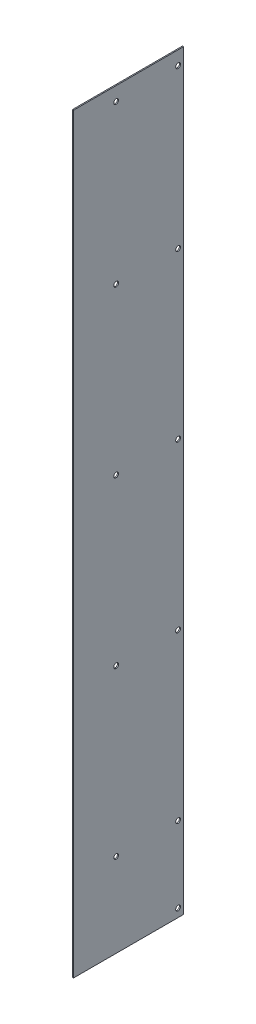
ISO-10303-21;
HEADER;
FILE_DESCRIPTION(('STEP AP214'),'2;1');
FILE_NAME('part.step','',(''),(''),'','','');
FILE_SCHEMA(('AUTOMOTIVE_DESIGN { 1 0 10303 214 1 1 1 1 }'));
ENDSEC;
DATA;
#1=APPLICATION_CONTEXT('core data for automotive mechanical design processes');
#2=APPLICATION_PROTOCOL_DEFINITION('international standard','automotive_design',2000,#1);
#3=PRODUCT_CONTEXT('',#1,'mechanical');
#4=PRODUCT('Part','Part','',(#3));
#5=PRODUCT_RELATED_PRODUCT_CATEGORY('part','',(#4));
#6=PRODUCT_DEFINITION_FORMATION('','',#4);
#7=PRODUCT_DEFINITION_CONTEXT('part definition',#1,'design');
#8=PRODUCT_DEFINITION('design','',#6,#7);
#9=PRODUCT_DEFINITION_SHAPE('','',#8);
#10=(LENGTH_UNIT() NAMED_UNIT(*) SI_UNIT(.MILLI.,.METRE.));
#11=(NAMED_UNIT(*) PLANE_ANGLE_UNIT() SI_UNIT($,.RADIAN.));
#12=(NAMED_UNIT(*) SI_UNIT($,.STERADIAN.) SOLID_ANGLE_UNIT());
#13=UNCERTAINTY_MEASURE_WITH_UNIT(LENGTH_MEASURE(1.E-05),#10,'distance_accuracy_value','');
#14=(GEOMETRIC_REPRESENTATION_CONTEXT(3) GLOBAL_UNCERTAINTY_ASSIGNED_CONTEXT((#13)) GLOBAL_UNIT_ASSIGNED_CONTEXT((#10,
#11,#12)) REPRESENTATION_CONTEXT('',''));
#15=CARTESIAN_POINT('',(0.,0.,0.));
#16=DIRECTION('',(0.,0.,1.));
#17=DIRECTION('',(1.,0.,0.));
#18=AXIS2_PLACEMENT_3D('',#15,#16,#17);
#19=CARTESIAN_POINT('',(1.6,-2.22044604925031E-13,-160.));
#20=DIRECTION('',(0.,1.,0.));
#21=DIRECTION('',(0.,0.,1.));
#22=AXIS2_PLACEMENT_3D('',#19,#20,#21);
#23=PLANE('',#22);
#24=DIRECTION('',(0.,0.,-1.));
#25=VECTOR('',#24,1.);
#26=CARTESIAN_POINT('',(0.,-2.22044604925031E-13,-160.));
#27=LINE('',#26,#25);
#28=CARTESIAN_POINT('',(0.,0.,0.));
#29=VERTEX_POINT('',#28);
#30=CARTESIAN_POINT('',(0.,-2.22044604925031E-13,-160.));
#31=VERTEX_POINT('',#30);
#32=EDGE_CURVE('E103',#29,#31,#27,.T.);
#33=ORIENTED_EDGE('',*,*,#32,.T.);
#34=DIRECTION('',(-1.,0.,0.));
#35=VECTOR('',#34,1.);
#36=CARTESIAN_POINT('',(1.6,-2.22044604925031E-13,-160.));
#37=LINE('',#36,#35);
#38=CARTESIAN_POINT('',(1.6,-2.22044604925031E-13,-160.));
#39=VERTEX_POINT('',#38);
#40=EDGE_CURVE('E94',#39,#31,#37,.T.);
#41=ORIENTED_EDGE('',*,*,#40,.F.);
#42=DIRECTION('',(0.,0.,-1.));
#43=VECTOR('',#42,1.);
#44=CARTESIAN_POINT('',(1.6,-2.22044604925031E-13,-160.));
#45=LINE('',#44,#43);
#46=CARTESIAN_POINT('',(1.6,0.,0.));
#47=VERTEX_POINT('',#46);
#48=EDGE_CURVE('E88',#47,#39,#45,.T.);
#49=ORIENTED_EDGE('',*,*,#48,.F.);
#50=DIRECTION('',(-1.,0.,0.));
#51=VECTOR('',#50,1.);
#52=CARTESIAN_POINT('',(1.6,0.,0.));
#53=LINE('',#52,#51);
#54=EDGE_CURVE('E99',#47,#29,#53,.T.);
#55=ORIENTED_EDGE('',*,*,#54,.T.);
#56=EDGE_LOOP('',(#33,#41,#49,#55));
#57=FACE_BOUND('',#56,.T.);
#58=ADVANCED_FACE('F34',(#57),#23,.F.);
#59=CARTESIAN_POINT('',(1.6,-2.22044604925031E-13,-160.));
#60=DIRECTION('',(0.,0.,1.));
#61=DIRECTION('',(1.,0.,0.));
#62=AXIS2_PLACEMENT_3D('',#59,#60,#61);
#63=PLANE('',#62);
#64=DIRECTION('',(0.,1.,0.));
#65=VECTOR('',#64,1.);
#66=CARTESIAN_POINT('',(0.,-2.22044604925031E-13,-160.));
#67=LINE('',#66,#65);
#68=CARTESIAN_POINT('',(0.,1092.,-160.));
#69=VERTEX_POINT('',#68);
#70=EDGE_CURVE('E93',#31,#69,#67,.T.);
#71=ORIENTED_EDGE('',*,*,#70,.T.);
#72=DIRECTION('',(-1.,0.,0.));
#73=VECTOR('',#72,1.);
#74=CARTESIAN_POINT('',(1.6,1092.,-160.));
#75=LINE('',#74,#73);
#76=CARTESIAN_POINT('',(1.6,1092.,-160.));
#77=VERTEX_POINT('',#76);
#78=EDGE_CURVE('E91',#77,#69,#75,.T.);
#79=ORIENTED_EDGE('',*,*,#78,.F.);
#80=DIRECTION('',(0.,1.,0.));
#81=VECTOR('',#80,1.);
#82=CARTESIAN_POINT('',(1.6,-2.22044604925031E-13,-160.));
#83=LINE('',#82,#81);
#84=EDGE_CURVE('E82',#39,#77,#83,.T.);
#85=ORIENTED_EDGE('',*,*,#84,.F.);
#86=ORIENTED_EDGE('',*,*,#40,.T.);
#87=EDGE_LOOP('',(#71,#79,#85,#86));
#88=FACE_BOUND('',#87,.T.);
#89=ADVANCED_FACE('F92',(#88),#63,.F.);
#90=CARTESIAN_POINT('',(1.6,1092.,-160.));
#91=DIRECTION('',(0.,-1.,0.));
#92=DIRECTION('',(0.,0.,-1.));
#93=AXIS2_PLACEMENT_3D('',#90,#91,#92);
#94=PLANE('',#93);
#95=DIRECTION('',(0.,0.,1.));
#96=VECTOR('',#95,1.);
#97=CARTESIAN_POINT('',(0.,1092.,-160.));
#98=LINE('',#97,#96);
#99=CARTESIAN_POINT('',(0.,1092.,0.));
#100=VERTEX_POINT('',#99);
#101=EDGE_CURVE('E68',#69,#100,#98,.T.);
#102=ORIENTED_EDGE('',*,*,#101,.T.);
#103=DIRECTION('',(-1.,0.,0.));
#104=VECTOR('',#103,1.);
#105=CARTESIAN_POINT('',(1.6,1092.,0.));
#106=LINE('',#105,#104);
#107=CARTESIAN_POINT('',(1.6,1092.,0.));
#108=VERTEX_POINT('',#107);
#109=EDGE_CURVE('E95',#108,#100,#106,.T.);
#110=ORIENTED_EDGE('',*,*,#109,.F.);
#111=DIRECTION('',(0.,0.,1.));
#112=VECTOR('',#111,1.);
#113=CARTESIAN_POINT('',(1.6,1092.,-160.));
#114=LINE('',#113,#112);
#115=EDGE_CURVE('E86',#77,#108,#114,.T.);
#116=ORIENTED_EDGE('',*,*,#115,.F.);
#117=ORIENTED_EDGE('',*,*,#78,.T.);
#118=EDGE_LOOP('',(#102,#110,#116,#117));
#119=FACE_BOUND('',#118,.T.);
#120=ADVANCED_FACE('F97',(#119),#94,.F.);
#121=CARTESIAN_POINT('',(1.6,0.,0.));
#122=DIRECTION('',(0.,0.,-1.));
#123=DIRECTION('',(-1.,0.,0.));
#124=AXIS2_PLACEMENT_3D('',#121,#122,#123);
#125=PLANE('',#124);
#126=DIRECTION('',(0.,-1.,0.));
#127=VECTOR('',#126,1.);
#128=CARTESIAN_POINT('',(0.,0.,0.));
#129=LINE('',#128,#127);
#130=EDGE_CURVE('E74',#100,#29,#129,.T.);
#131=ORIENTED_EDGE('',*,*,#130,.T.);
#132=ORIENTED_EDGE('',*,*,#54,.F.);
#133=DIRECTION('',(0.,-1.,0.));
#134=VECTOR('',#133,1.);
#135=CARTESIAN_POINT('',(1.6,0.,0.));
#136=LINE('',#135,#134);
#137=EDGE_CURVE('E51',#108,#47,#136,.T.);
#138=ORIENTED_EDGE('',*,*,#137,.F.);
#139=ORIENTED_EDGE('',*,*,#109,.T.);
#140=EDGE_LOOP('',(#131,#132,#138,#139));
#141=FACE_BOUND('',#140,.T.);
#142=ADVANCED_FACE('F147',(#141),#125,.F.);
#143=CARTESIAN_POINT('',(1.6,0.,0.));
#144=DIRECTION('',(-1.,0.,0.));
#145=DIRECTION('',(0.,0.,1.));
#146=AXIS2_PLACEMENT_3D('',#143,#144,#145);
#147=PLANE('',#146);
#148=CARTESIAN_POINT('',(1.6,362.,-61.9999999999999));
#149=DIRECTION('',(-1.,0.,0.));
#150=DIRECTION('',(0.,0.,1.));
#151=AXIS2_PLACEMENT_3D('',#148,#149,#150);
#152=CIRCLE('',#151,3.49999999999999);
#153=CARTESIAN_POINT('',(1.6,362.,-58.4999999999999));
#154=VERTEX_POINT('',#153);
#155=EDGE_CURVE('E254',#154,#154,#152,.T.);
#156=ORIENTED_EDGE('',*,*,#155,.T.);
#157=EDGE_LOOP('',(#156));
#158=FACE_BOUND('',#157,.T.);
#159=CARTESIAN_POINT('',(1.6,362.,-152.));
#160=DIRECTION('',(-1.,0.,0.));
#161=DIRECTION('',(0.,0.,1.));
#162=AXIS2_PLACEMENT_3D('',#159,#160,#161);
#163=CIRCLE('',#162,3.49999999999999);
#164=CARTESIAN_POINT('',(1.6,362.,-148.5));
#165=VERTEX_POINT('',#164);
#166=EDGE_CURVE('E248',#165,#165,#163,.T.);
#167=ORIENTED_EDGE('',*,*,#166,.T.);
#168=EDGE_LOOP('',(#167));
#169=FACE_BOUND('',#168,.T.);
#170=CARTESIAN_POINT('',(1.6,122.,-152.));
#171=DIRECTION('',(-1.,0.,0.));
#172=DIRECTION('',(0.,0.,1.));
#173=AXIS2_PLACEMENT_3D('',#170,#171,#172);
#174=CIRCLE('',#173,3.49999999999999);
#175=CARTESIAN_POINT('',(1.6,122.,-148.5));
#176=VERTEX_POINT('',#175);
#177=EDGE_CURVE('E242',#176,#176,#174,.T.);
#178=ORIENTED_EDGE('',*,*,#177,.T.);
#179=EDGE_LOOP('',(#178));
#180=FACE_BOUND('',#179,.T.);
#181=CARTESIAN_POINT('',(1.6,122.,-61.9999999999999));
#182=DIRECTION('',(-1.,0.,0.));
#183=DIRECTION('',(0.,0.,1.));
#184=AXIS2_PLACEMENT_3D('',#181,#182,#183);
#185=CIRCLE('',#184,3.49999999999999);
#186=CARTESIAN_POINT('',(1.6,122.,-58.4999999999999));
#187=VERTEX_POINT('',#186);
#188=EDGE_CURVE('E236',#187,#187,#185,.T.);
#189=ORIENTED_EDGE('',*,*,#188,.T.);
#190=EDGE_LOOP('',(#189));
#191=FACE_BOUND('',#190,.T.);
#192=CARTESIAN_POINT('',(1.6,12.,-152.));
#193=DIRECTION('',(-1.,0.,0.));
#194=DIRECTION('',(0.,0.,1.));
#195=AXIS2_PLACEMENT_3D('',#192,#193,#194);
#196=CIRCLE('',#195,3.49999999999999);
#197=CARTESIAN_POINT('',(1.6,12.,-148.5));
#198=VERTEX_POINT('',#197);
#199=EDGE_CURVE('E223',#198,#198,#196,.T.);
#200=ORIENTED_EDGE('',*,*,#199,.T.);
#201=EDGE_LOOP('',(#200));
#202=FACE_BOUND('',#201,.T.);
#203=CARTESIAN_POINT('',(1.6,1072.,-152.));
#204=DIRECTION('',(-1.,0.,0.));
#205=DIRECTION('',(0.,0.,1.));
#206=AXIS2_PLACEMENT_3D('',#203,#204,#205);
#207=CIRCLE('',#206,3.50000000000006);
#208=CARTESIAN_POINT('',(1.6,1072.,-148.5));
#209=VERTEX_POINT('',#208);
#210=EDGE_CURVE('E217',#209,#209,#207,.T.);
#211=ORIENTED_EDGE('',*,*,#210,.T.);
#212=EDGE_LOOP('',(#211));
#213=FACE_BOUND('',#212,.T.);
#214=CARTESIAN_POINT('',(1.6,1072.,-62.));
#215=DIRECTION('',(-1.,0.,0.));
#216=DIRECTION('',(0.,0.,1.));
#217=AXIS2_PLACEMENT_3D('',#214,#215,#216);
#218=CIRCLE('',#217,3.50000000000006);
#219=CARTESIAN_POINT('',(1.6,1072.,-58.4999999999999));
#220=VERTEX_POINT('',#219);
#221=EDGE_CURVE('E106',#220,#220,#218,.T.);
#222=ORIENTED_EDGE('',*,*,#221,.T.);
#223=EDGE_LOOP('',(#222));
#224=FACE_BOUND('',#223,.T.);
#225=ORIENTED_EDGE('',*,*,#48,.T.);
#226=ORIENTED_EDGE('',*,*,#84,.T.);
#227=ORIENTED_EDGE('',*,*,#115,.T.);
#228=ORIENTED_EDGE('',*,*,#137,.T.);
#229=EDGE_LOOP('',(#225,#226,#227,#228));
#230=FACE_BOUND('',#229,.T.);
#231=CARTESIAN_POINT('',(1.6,602.,-152.));
#232=DIRECTION('',(-1.,0.,0.));
#233=DIRECTION('',(0.,0.,1.));
#234=AXIS2_PLACEMENT_3D('',#231,#232,#233);
#235=CIRCLE('',#234,3.49999999999999);
#236=CARTESIAN_POINT('',(1.6,602.,-148.5));
#237=VERTEX_POINT('',#236);
#238=EDGE_CURVE('E116',#237,#237,#235,.T.);
#239=ORIENTED_EDGE('',*,*,#238,.T.);
#240=EDGE_LOOP('',(#239));
#241=FACE_BOUND('',#240,.T.);
#242=CARTESIAN_POINT('',(1.6,842.,-152.));
#243=DIRECTION('',(-1.,0.,0.));
#244=DIRECTION('',(0.,0.,1.));
#245=AXIS2_PLACEMENT_3D('',#242,#243,#244);
#246=CIRCLE('',#245,3.49999999999999);
#247=CARTESIAN_POINT('',(1.6,842.,-148.5));
#248=VERTEX_POINT('',#247);
#249=EDGE_CURVE('E122',#248,#248,#246,.T.);
#250=ORIENTED_EDGE('',*,*,#249,.T.);
#251=EDGE_LOOP('',(#250));
#252=FACE_BOUND('',#251,.T.);
#253=CARTESIAN_POINT('',(1.6,602.,-61.9999999999999));
#254=DIRECTION('',(-1.,0.,0.));
#255=DIRECTION('',(0.,0.,1.));
#256=AXIS2_PLACEMENT_3D('',#253,#254,#255);
#257=CIRCLE('',#256,3.49999999999999);
#258=CARTESIAN_POINT('',(1.6,602.,-58.4999999999999));
#259=VERTEX_POINT('',#258);
#260=EDGE_CURVE('E128',#259,#259,#257,.T.);
#261=ORIENTED_EDGE('',*,*,#260,.T.);
#262=EDGE_LOOP('',(#261));
#263=FACE_BOUND('',#262,.T.);
#264=CARTESIAN_POINT('',(1.6,842.,-61.9999999999999));
#265=DIRECTION('',(-1.,0.,0.));
#266=DIRECTION('',(0.,0.,1.));
#267=AXIS2_PLACEMENT_3D('',#264,#265,#266);
#268=CIRCLE('',#267,3.49999999999999);
#269=CARTESIAN_POINT('',(1.6,842.,-58.4999999999999));
#270=VERTEX_POINT('',#269);
#271=EDGE_CURVE('E11',#270,#270,#268,.T.);
#272=ORIENTED_EDGE('',*,*,#271,.T.);
#273=EDGE_LOOP('',(#272));
#274=FACE_BOUND('',#273,.T.);
#275=ADVANCED_FACE('F83',(#158,#169,#180,#191,#202,#213,#224,#230,#241,#252,#263,#274),#147,.F.);
#276=CARTESIAN_POINT('',(0.,0.,0.));
#277=DIRECTION('',(-1.,0.,0.));
#278=DIRECTION('',(0.,0.,1.));
#279=AXIS2_PLACEMENT_3D('',#276,#277,#278);
#280=PLANE('',#279);
#281=CARTESIAN_POINT('',(0.,362.,-61.9999999999999));
#282=DIRECTION('',(-1.,0.,0.));
#283=DIRECTION('',(0.,0.,1.));
#284=AXIS2_PLACEMENT_3D('',#281,#282,#283);
#285=CIRCLE('',#284,3.49999999999999);
#286=CARTESIAN_POINT('',(0.,362.,-58.4999999999999));
#287=VERTEX_POINT('',#286);
#288=EDGE_CURVE('E257',#287,#287,#285,.T.);
#289=ORIENTED_EDGE('',*,*,#288,.F.);
#290=EDGE_LOOP('',(#289));
#291=FACE_BOUND('',#290,.T.);
#292=CARTESIAN_POINT('',(0.,362.,-152.));
#293=DIRECTION('',(-1.,0.,0.));
#294=DIRECTION('',(0.,0.,1.));
#295=AXIS2_PLACEMENT_3D('',#292,#293,#294);
#296=CIRCLE('',#295,3.49999999999999);
#297=CARTESIAN_POINT('',(0.,362.,-148.5));
#298=VERTEX_POINT('',#297);
#299=EDGE_CURVE('E251',#298,#298,#296,.T.);
#300=ORIENTED_EDGE('',*,*,#299,.F.);
#301=EDGE_LOOP('',(#300));
#302=FACE_BOUND('',#301,.T.);
#303=CARTESIAN_POINT('',(0.,122.,-152.));
#304=DIRECTION('',(-1.,0.,0.));
#305=DIRECTION('',(0.,0.,1.));
#306=AXIS2_PLACEMENT_3D('',#303,#304,#305);
#307=CIRCLE('',#306,3.49999999999999);
#308=CARTESIAN_POINT('',(0.,122.,-148.5));
#309=VERTEX_POINT('',#308);
#310=EDGE_CURVE('E245',#309,#309,#307,.T.);
#311=ORIENTED_EDGE('',*,*,#310,.F.);
#312=EDGE_LOOP('',(#311));
#313=FACE_BOUND('',#312,.T.);
#314=CARTESIAN_POINT('',(0.,122.,-61.9999999999999));
#315=DIRECTION('',(-1.,0.,0.));
#316=DIRECTION('',(0.,0.,1.));
#317=AXIS2_PLACEMENT_3D('',#314,#315,#316);
#318=CIRCLE('',#317,3.49999999999999);
#319=CARTESIAN_POINT('',(0.,122.,-58.4999999999999));
#320=VERTEX_POINT('',#319);
#321=EDGE_CURVE('E239',#320,#320,#318,.T.);
#322=ORIENTED_EDGE('',*,*,#321,.F.);
#323=EDGE_LOOP('',(#322));
#324=FACE_BOUND('',#323,.T.);
#325=CARTESIAN_POINT('',(0.,12.,-152.));
#326=DIRECTION('',(-1.,0.,0.));
#327=DIRECTION('',(0.,0.,1.));
#328=AXIS2_PLACEMENT_3D('',#325,#326,#327);
#329=CIRCLE('',#328,3.49999999999999);
#330=CARTESIAN_POINT('',(0.,12.,-148.5));
#331=VERTEX_POINT('',#330);
#332=EDGE_CURVE('E233',#331,#331,#329,.T.);
#333=ORIENTED_EDGE('',*,*,#332,.F.);
#334=EDGE_LOOP('',(#333));
#335=FACE_BOUND('',#334,.T.);
#336=CARTESIAN_POINT('',(0.,1072.,-152.));
#337=DIRECTION('',(-1.,0.,0.));
#338=DIRECTION('',(0.,0.,1.));
#339=AXIS2_PLACEMENT_3D('',#336,#337,#338);
#340=CIRCLE('',#339,3.50000000000006);
#341=CARTESIAN_POINT('',(0.,1072.,-148.5));
#342=VERTEX_POINT('',#341);
#343=EDGE_CURVE('E214',#342,#342,#340,.T.);
#344=ORIENTED_EDGE('',*,*,#343,.F.);
#345=EDGE_LOOP('',(#344));
#346=FACE_BOUND('',#345,.T.);
#347=CARTESIAN_POINT('',(0.,1072.,-62.));
#348=DIRECTION('',(-1.,0.,0.));
#349=DIRECTION('',(0.,0.,1.));
#350=AXIS2_PLACEMENT_3D('',#347,#348,#349);
#351=CIRCLE('',#350,3.50000000000006);
#352=CARTESIAN_POINT('',(0.,1072.,-58.4999999999999));
#353=VERTEX_POINT('',#352);
#354=EDGE_CURVE('E219',#353,#353,#351,.T.);
#355=ORIENTED_EDGE('',*,*,#354,.F.);
#356=EDGE_LOOP('',(#355));
#357=FACE_BOUND('',#356,.T.);
#358=ORIENTED_EDGE('',*,*,#32,.F.);
#359=ORIENTED_EDGE('',*,*,#130,.F.);
#360=ORIENTED_EDGE('',*,*,#101,.F.);
#361=ORIENTED_EDGE('',*,*,#70,.F.);
#362=EDGE_LOOP('',(#358,#359,#360,#361));
#363=FACE_BOUND('',#362,.T.);
#364=CARTESIAN_POINT('',(0.,602.,-152.));
#365=DIRECTION('',(-1.,0.,0.));
#366=DIRECTION('',(0.,0.,1.));
#367=AXIS2_PLACEMENT_3D('',#364,#365,#366);
#368=CIRCLE('',#367,3.49999999999999);
#369=CARTESIAN_POINT('',(0.,602.,-148.5));
#370=VERTEX_POINT('',#369);
#371=EDGE_CURVE('E113',#370,#370,#368,.T.);
#372=ORIENTED_EDGE('',*,*,#371,.F.);
#373=EDGE_LOOP('',(#372));
#374=FACE_BOUND('',#373,.T.);
#375=CARTESIAN_POINT('',(0.,842.,-152.));
#376=DIRECTION('',(-1.,0.,0.));
#377=DIRECTION('',(0.,0.,1.));
#378=AXIS2_PLACEMENT_3D('',#375,#376,#377);
#379=CIRCLE('',#378,3.49999999999999);
#380=CARTESIAN_POINT('',(0.,842.,-148.5));
#381=VERTEX_POINT('',#380);
#382=EDGE_CURVE('E119',#381,#381,#379,.T.);
#383=ORIENTED_EDGE('',*,*,#382,.F.);
#384=EDGE_LOOP('',(#383));
#385=FACE_BOUND('',#384,.T.);
#386=CARTESIAN_POINT('',(0.,602.,-61.9999999999999));
#387=DIRECTION('',(-1.,0.,0.));
#388=DIRECTION('',(0.,0.,1.));
#389=AXIS2_PLACEMENT_3D('',#386,#387,#388);
#390=CIRCLE('',#389,3.49999999999999);
#391=CARTESIAN_POINT('',(0.,602.,-58.4999999999999));
#392=VERTEX_POINT('',#391);
#393=EDGE_CURVE('E125',#392,#392,#390,.T.);
#394=ORIENTED_EDGE('',*,*,#393,.F.);
#395=EDGE_LOOP('',(#394));
#396=FACE_BOUND('',#395,.T.);
#397=CARTESIAN_POINT('',(0.,842.,-61.9999999999999));
#398=DIRECTION('',(-1.,0.,0.));
#399=DIRECTION('',(0.,0.,1.));
#400=AXIS2_PLACEMENT_3D('',#397,#398,#399);
#401=CIRCLE('',#400,3.49999999999999);
#402=CARTESIAN_POINT('',(0.,842.,-58.4999999999999));
#403=VERTEX_POINT('',#402);
#404=EDGE_CURVE('E43',#403,#403,#401,.T.);
#405=ORIENTED_EDGE('',*,*,#404,.F.);
#406=EDGE_LOOP('',(#405));
#407=FACE_BOUND('',#406,.T.);
#408=ADVANCED_FACE('F135',(#291,#302,#313,#324,#335,#346,#357,#363,#374,#385,#396,#407),#280,.T.);
#409=CARTESIAN_POINT('',(0.,1072.,-62.));
#410=DIRECTION('',(-1.,0.,0.));
#411=DIRECTION('',(0.,0.,1.));
#412=AXIS2_PLACEMENT_3D('',#409,#410,#411);
#413=CYLINDRICAL_SURFACE('',#412,3.50000000000006);
#414=ORIENTED_EDGE('',*,*,#354,.T.);
#415=EDGE_LOOP('',(#414));
#416=FACE_BOUND('',#415,.T.);
#417=ORIENTED_EDGE('',*,*,#221,.F.);
#418=EDGE_LOOP('',(#417));
#419=FACE_BOUND('',#418,.T.);
#420=ADVANCED_FACE('F137',(#416,#419),#413,.F.);
#421=CARTESIAN_POINT('',(0.,1072.,-152.));
#422=DIRECTION('',(-1.,0.,0.));
#423=DIRECTION('',(0.,0.,1.));
#424=AXIS2_PLACEMENT_3D('',#421,#422,#423);
#425=CYLINDRICAL_SURFACE('',#424,3.50000000000006);
#426=ORIENTED_EDGE('',*,*,#343,.T.);
#427=EDGE_LOOP('',(#426));
#428=FACE_BOUND('',#427,.T.);
#429=ORIENTED_EDGE('',*,*,#210,.F.);
#430=EDGE_LOOP('',(#429));
#431=FACE_BOUND('',#430,.T.);
#432=ADVANCED_FACE('F144',(#428,#431),#425,.F.);
#433=CARTESIAN_POINT('',(0.,12.,-152.));
#434=DIRECTION('',(-1.,0.,0.));
#435=DIRECTION('',(0.,0.,1.));
#436=AXIS2_PLACEMENT_3D('',#433,#434,#435);
#437=CYLINDRICAL_SURFACE('',#436,3.49999999999999);
#438=ORIENTED_EDGE('',*,*,#332,.T.);
#439=EDGE_LOOP('',(#438));
#440=FACE_BOUND('',#439,.T.);
#441=ORIENTED_EDGE('',*,*,#199,.F.);
#442=EDGE_LOOP('',(#441));
#443=FACE_BOUND('',#442,.T.);
#444=ADVANCED_FACE('F202',(#440,#443),#437,.F.);
#445=CARTESIAN_POINT('',(0.,122.,-61.9999999999999));
#446=DIRECTION('',(-1.,0.,0.));
#447=DIRECTION('',(0.,0.,1.));
#448=AXIS2_PLACEMENT_3D('',#445,#446,#447);
#449=CYLINDRICAL_SURFACE('',#448,3.49999999999999);
#450=ORIENTED_EDGE('',*,*,#321,.T.);
#451=EDGE_LOOP('',(#450));
#452=FACE_BOUND('',#451,.T.);
#453=ORIENTED_EDGE('',*,*,#188,.F.);
#454=EDGE_LOOP('',(#453));
#455=FACE_BOUND('',#454,.T.);
#456=ADVANCED_FACE('F198',(#452,#455),#449,.F.);
#457=CARTESIAN_POINT('',(0.,122.,-152.));
#458=DIRECTION('',(-1.,0.,0.));
#459=DIRECTION('',(0.,0.,1.));
#460=AXIS2_PLACEMENT_3D('',#457,#458,#459);
#461=CYLINDRICAL_SURFACE('',#460,3.49999999999999);
#462=ORIENTED_EDGE('',*,*,#310,.T.);
#463=EDGE_LOOP('',(#462));
#464=FACE_BOUND('',#463,.T.);
#465=ORIENTED_EDGE('',*,*,#177,.F.);
#466=EDGE_LOOP('',(#465));
#467=FACE_BOUND('',#466,.T.);
#468=ADVANCED_FACE('F194',(#464,#467),#461,.F.);
#469=CARTESIAN_POINT('',(0.,362.,-152.));
#470=DIRECTION('',(-1.,0.,0.));
#471=DIRECTION('',(0.,0.,1.));
#472=AXIS2_PLACEMENT_3D('',#469,#470,#471);
#473=CYLINDRICAL_SURFACE('',#472,3.49999999999999);
#474=ORIENTED_EDGE('',*,*,#299,.T.);
#475=EDGE_LOOP('',(#474));
#476=FACE_BOUND('',#475,.T.);
#477=ORIENTED_EDGE('',*,*,#166,.F.);
#478=EDGE_LOOP('',(#477));
#479=FACE_BOUND('',#478,.T.);
#480=ADVANCED_FACE('F166',(#476,#479),#473,.F.);
#481=CARTESIAN_POINT('',(0.,602.,-152.));
#482=DIRECTION('',(-1.,0.,0.));
#483=DIRECTION('',(0.,0.,1.));
#484=AXIS2_PLACEMENT_3D('',#481,#482,#483);
#485=CYLINDRICAL_SURFACE('',#484,3.49999999999999);
#486=ORIENTED_EDGE('',*,*,#371,.T.);
#487=EDGE_LOOP('',(#486));
#488=FACE_BOUND('',#487,.T.);
#489=ORIENTED_EDGE('',*,*,#238,.F.);
#490=EDGE_LOOP('',(#489));
#491=FACE_BOUND('',#490,.T.);
#492=ADVANCED_FACE('F162',(#488,#491),#485,.F.);
#493=CARTESIAN_POINT('',(0.,842.,-152.));
#494=DIRECTION('',(-1.,0.,0.));
#495=DIRECTION('',(0.,0.,1.));
#496=AXIS2_PLACEMENT_3D('',#493,#494,#495);
#497=CYLINDRICAL_SURFACE('',#496,3.49999999999999);
#498=ORIENTED_EDGE('',*,*,#382,.T.);
#499=EDGE_LOOP('',(#498));
#500=FACE_BOUND('',#499,.T.);
#501=ORIENTED_EDGE('',*,*,#249,.F.);
#502=EDGE_LOOP('',(#501));
#503=FACE_BOUND('',#502,.T.);
#504=ADVANCED_FACE('F165',(#500,#503),#497,.F.);
#505=CARTESIAN_POINT('',(0.,362.,-61.9999999999999));
#506=DIRECTION('',(-1.,0.,0.));
#507=DIRECTION('',(0.,0.,1.));
#508=AXIS2_PLACEMENT_3D('',#505,#506,#507);
#509=CYLINDRICAL_SURFACE('',#508,3.49999999999999);
#510=ORIENTED_EDGE('',*,*,#288,.T.);
#511=EDGE_LOOP('',(#510));
#512=FACE_BOUND('',#511,.T.);
#513=ORIENTED_EDGE('',*,*,#155,.F.);
#514=EDGE_LOOP('',(#513));
#515=FACE_BOUND('',#514,.T.);
#516=ADVANCED_FACE('F169',(#512,#515),#509,.F.);
#517=CARTESIAN_POINT('',(0.,602.,-61.9999999999999));
#518=DIRECTION('',(-1.,0.,0.));
#519=DIRECTION('',(0.,0.,1.));
#520=AXIS2_PLACEMENT_3D('',#517,#518,#519);
#521=CYLINDRICAL_SURFACE('',#520,3.49999999999999);
#522=ORIENTED_EDGE('',*,*,#393,.T.);
#523=EDGE_LOOP('',(#522));
#524=FACE_BOUND('',#523,.T.);
#525=ORIENTED_EDGE('',*,*,#260,.F.);
#526=EDGE_LOOP('',(#525));
#527=FACE_BOUND('',#526,.T.);
#528=ADVANCED_FACE('F171',(#524,#527),#521,.F.);
#529=CARTESIAN_POINT('',(0.,842.,-61.9999999999999));
#530=DIRECTION('',(-1.,0.,0.));
#531=DIRECTION('',(0.,0.,1.));
#532=AXIS2_PLACEMENT_3D('',#529,#530,#531);
#533=CYLINDRICAL_SURFACE('',#532,3.49999999999999);
#534=ORIENTED_EDGE('',*,*,#404,.T.);
#535=EDGE_LOOP('',(#534));
#536=FACE_BOUND('',#535,.T.);
#537=ORIENTED_EDGE('',*,*,#271,.F.);
#538=EDGE_LOOP('',(#537));
#539=FACE_BOUND('',#538,.T.);
#540=ADVANCED_FACE('F36',(#536,#539),#533,.F.);
#541=CLOSED_SHELL('',(#58,#89,#120,#142,#275,#408,#420,#432,#444,#456,#468,#480,#492,#504,#516,
#528,#540));
#542=MANIFOLD_SOLID_BREP('B2',#541);
#543=ADVANCED_BREP_SHAPE_REPRESENTATION('',(#18,#542),#14);
#544=SHAPE_DEFINITION_REPRESENTATION(#9,#543);
ENDSEC;
END-ISO-10303-21;
